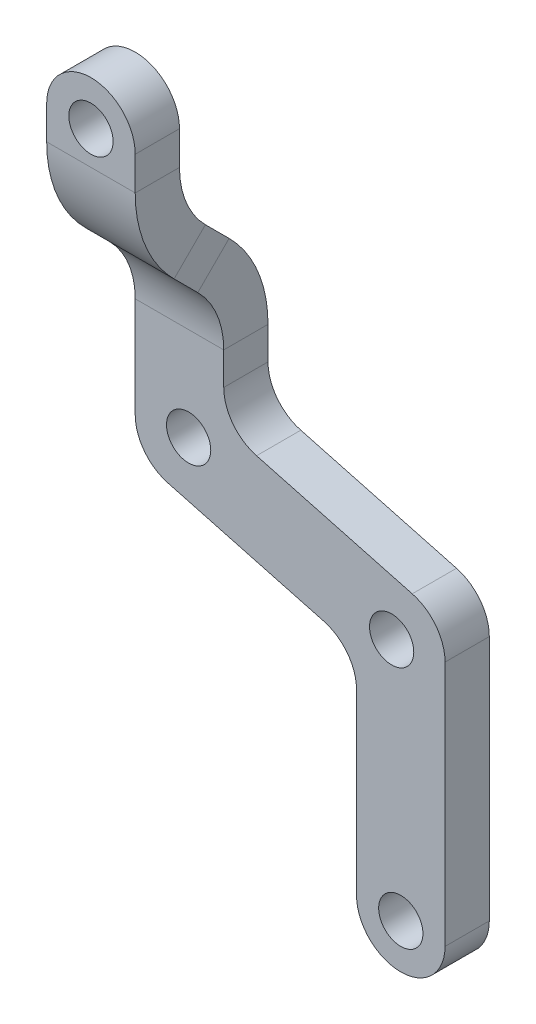
ISO-10303-21;
HEADER;
FILE_DESCRIPTION(('STEP AP214'),'2;1');
FILE_NAME('part.step','',(''),(''),'','','');
FILE_SCHEMA(('AUTOMOTIVE_DESIGN { 1 0 10303 214 1 1 1 1 }'));
ENDSEC;
DATA;
#1=APPLICATION_CONTEXT('core data for automotive mechanical design processes');
#2=APPLICATION_PROTOCOL_DEFINITION('international standard','automotive_design',2000,#1);
#3=PRODUCT_CONTEXT('',#1,'mechanical');
#4=PRODUCT('Part','Part','',(#3));
#5=PRODUCT_RELATED_PRODUCT_CATEGORY('part','',(#4));
#6=PRODUCT_DEFINITION_FORMATION('','',#4);
#7=PRODUCT_DEFINITION_CONTEXT('part definition',#1,'design');
#8=PRODUCT_DEFINITION('design','',#6,#7);
#9=PRODUCT_DEFINITION_SHAPE('','',#8);
#10=(LENGTH_UNIT() NAMED_UNIT(*) SI_UNIT(.MILLI.,.METRE.));
#11=(NAMED_UNIT(*) PLANE_ANGLE_UNIT() SI_UNIT($,.RADIAN.));
#12=(NAMED_UNIT(*) SI_UNIT($,.STERADIAN.) SOLID_ANGLE_UNIT());
#13=UNCERTAINTY_MEASURE_WITH_UNIT(LENGTH_MEASURE(1.E-05),#10,'distance_accuracy_value','');
#14=(GEOMETRIC_REPRESENTATION_CONTEXT(3) GLOBAL_UNCERTAINTY_ASSIGNED_CONTEXT((#13)) GLOBAL_UNIT_ASSIGNED_CONTEXT((#10,
#11,#12)) REPRESENTATION_CONTEXT('',''));
#15=CARTESIAN_POINT('',(0.,0.,0.));
#16=DIRECTION('',(0.,0.,1.));
#17=DIRECTION('',(1.,0.,0.));
#18=AXIS2_PLACEMENT_3D('',#15,#16,#17);
#19=CARTESIAN_POINT('',(0.,5.94666081272551,-8.05799540912749));
#20=DIRECTION('',(0.,-0.707106781186549,0.707106781186546));
#21=DIRECTION('',(1.,0.,0.));
#22=AXIS2_PLACEMENT_3D('',#19,#20,#21);
#23=PLANE('',#22);
#24=DIRECTION('',(0.,0.707106781186546,0.707106781186549));
#25=VECTOR('',#24,1.);
#26=CARTESIAN_POINT('',(-7.5,5.94666081272551,-8.05799540912749));
#27=LINE('',#26,#25);
#28=CARTESIAN_POINT('',(-7.5,21.0757240337185,7.07106781186551));
#29=VERTEX_POINT('',#28);
#30=CARTESIAN_POINT('',(-7.5,18.3980545040548,4.39339828220182));
#31=VERTEX_POINT('',#30);
#32=EDGE_CURVE('E246',#29,#31,#27,.F.);
#33=ORIENTED_EDGE('',*,*,#32,.T.);
#34=DIRECTION('',(-1.,0.,0.));
#35=VECTOR('',#34,1.);
#36=CARTESIAN_POINT('',(0.,18.3980545040548,4.39339828220182));
#37=LINE('',#36,#35);
#38=CARTESIAN_POINT('',(-17.5,18.3980545040548,4.39339828220182));
#39=VERTEX_POINT('',#38);
#40=EDGE_CURVE('E310',#31,#39,#37,.T.);
#41=ORIENTED_EDGE('',*,*,#40,.T.);
#42=DIRECTION('',(0.,0.707106781186546,0.707106781186549));
#43=VECTOR('',#42,1.);
#44=CARTESIAN_POINT('',(-17.5,5.94666081272551,-8.05799540912749));
#45=LINE('',#44,#43);
#46=CARTESIAN_POINT('',(-17.5,21.0757240337185,7.07106781186554));
#47=VERTEX_POINT('',#46);
#48=EDGE_CURVE('E329',#47,#39,#45,.F.);
#49=ORIENTED_EDGE('',*,*,#48,.F.);
#50=DIRECTION('',(-1.,0.,0.));
#51=VECTOR('',#50,1.);
#52=CARTESIAN_POINT('',(0.,21.0757240337185,7.07106781186554));
#53=LINE('',#52,#51);
#54=EDGE_CURVE('E322',#29,#47,#53,.T.);
#55=ORIENTED_EDGE('',*,*,#54,.F.);
#56=EDGE_LOOP('',(#33,#41,#49,#55));
#57=FACE_BOUND('',#56,.T.);
#58=ADVANCED_FACE('F44',(#57),#23,.F.);
#59=CARTESIAN_POINT('',(0.,2.41112690679276,-4.52246150319476));
#60=DIRECTION('',(0.,-0.707106781186549,0.707106781186546));
#61=DIRECTION('',(1.,0.,0.));
#62=AXIS2_PLACEMENT_3D('',#59,#60,#61);
#63=PLANE('',#62);
#64=DIRECTION('',(-1.,0.,0.));
#65=VECTOR('',#64,1.);
#66=CARTESIAN_POINT('',(0.,14.862520598122,7.92893218813452));
#67=LINE('',#66,#65);
#68=CARTESIAN_POINT('',(-7.5,14.862520598122,7.92893218813454));
#69=VERTEX_POINT('',#68);
#70=CARTESIAN_POINT('',(-17.5,14.862520598122,7.92893218813455));
#71=VERTEX_POINT('',#70);
#72=EDGE_CURVE('E303',#69,#71,#67,.T.);
#73=ORIENTED_EDGE('',*,*,#72,.F.);
#74=DIRECTION('',(0.,-0.707106781186546,-0.707106781186549));
#75=VECTOR('',#74,1.);
#76=CARTESIAN_POINT('',(-7.5,2.41112690679276,-4.52246150319476));
#77=LINE('',#76,#75);
#78=CARTESIAN_POINT('',(-7.5,17.5401901277857,10.6066017177982));
#79=VERTEX_POINT('',#78);
#80=EDGE_CURVE('E331',#79,#69,#77,.T.);
#81=ORIENTED_EDGE('',*,*,#80,.F.);
#82=DIRECTION('',(-1.,0.,0.));
#83=VECTOR('',#82,1.);
#84=CARTESIAN_POINT('',(0.,17.5401901277857,10.6066017177982));
#85=LINE('',#84,#83);
#86=CARTESIAN_POINT('',(-17.5,17.5401901277857,10.6066017177982));
#87=VERTEX_POINT('',#86);
#88=EDGE_CURVE('E316',#79,#87,#85,.T.);
#89=ORIENTED_EDGE('',*,*,#88,.T.);
#90=DIRECTION('',(0.,-0.707106781186546,-0.707106781186549));
#91=VECTOR('',#90,1.);
#92=CARTESIAN_POINT('',(-17.5,2.41112690679276,-4.52246150319476));
#93=LINE('',#92,#91);
#94=EDGE_CURVE('E307',#87,#71,#93,.T.);
#95=ORIENTED_EDGE('',*,*,#94,.T.);
#96=EDGE_LOOP('',(#73,#81,#89,#95));
#97=FACE_BOUND('',#96,.T.);
#98=ADVANCED_FACE('F432',(#97),#63,.T.);
#99=CARTESIAN_POINT('',(-7.5,2.41112690679276,-4.52246150319476));
#100=DIRECTION('',(-1.,0.,0.));
#101=DIRECTION('',(0.,-0.707106781186546,-0.707106781186549));
#102=AXIS2_PLACEMENT_3D('',#99,#100,#101);
#103=PLANE('',#102);
#104=DIRECTION('',(0.,-0.707106781186554,0.707106781186541));
#105=VECTOR('',#104,1.);
#106=CARTESIAN_POINT('',(-7.5,14.8625205981219,7.92893218813461));
#107=LINE('',#106,#105);
#108=EDGE_CURVE('E313',#31,#69,#107,.T.);
#109=ORIENTED_EDGE('',*,*,#108,.F.);
#110=ORIENTED_EDGE('',*,*,#32,.F.);
#111=DIRECTION('',(0.,-0.707106781186554,0.707106781186541));
#112=VECTOR('',#111,1.);
#113=CARTESIAN_POINT('',(-7.5,17.5401901277856,10.6066017177984));
#114=LINE('',#113,#112);
#115=EDGE_CURVE('E319',#29,#79,#114,.T.);
#116=ORIENTED_EDGE('',*,*,#115,.T.);
#117=ORIENTED_EDGE('',*,*,#80,.T.);
#118=EDGE_LOOP('',(#109,#110,#116,#117));
#119=FACE_BOUND('',#118,.T.);
#120=ADVANCED_FACE('F469',(#119),#103,.F.);
#121=CARTESIAN_POINT('',(-17.5,2.41112690679276,-4.52246150319476));
#122=DIRECTION('',(-1.,0.,0.));
#123=DIRECTION('',(0.,-0.707106781186546,-0.707106781186549));
#124=AXIS2_PLACEMENT_3D('',#121,#122,#123);
#125=PLANE('',#124);
#126=DIRECTION('',(0.,0.707106781186554,-0.707106781186541));
#127=VECTOR('',#126,1.);
#128=CARTESIAN_POINT('',(-17.5,14.8625205981219,7.92893218813461));
#129=LINE('',#128,#127);
#130=EDGE_CURVE('E306',#71,#39,#129,.T.);
#131=ORIENTED_EDGE('',*,*,#130,.F.);
#132=ORIENTED_EDGE('',*,*,#94,.F.);
#133=DIRECTION('',(0.,0.707106781186554,-0.707106781186541));
#134=VECTOR('',#133,1.);
#135=CARTESIAN_POINT('',(-17.5,17.5401901277856,10.6066017177984));
#136=LINE('',#135,#134);
#137=EDGE_CURVE('E325',#87,#47,#136,.T.);
#138=ORIENTED_EDGE('',*,*,#137,.T.);
#139=ORIENTED_EDGE('',*,*,#48,.T.);
#140=EDGE_LOOP('',(#131,#132,#138,#139));
#141=FACE_BOUND('',#140,.T.);
#142=ADVANCED_FACE('F429',(#141),#125,.T.);
#143=CARTESIAN_POINT('',(0.334936490538905,-1.81641159001248,5.));
#144=DIRECTION('',(-0.258819045102521,-0.965925826289068,0.));
#145=DIRECTION('',(0.965925826289068,-0.258819045102521,0.));
#146=AXIS2_PLACEMENT_3D('',#143,#144,#145);
#147=PLANE('',#146);
#148=DIRECTION('',(0.965925826289068,-0.258819045102521,0.));
#149=VECTOR('',#148,1.);
#150=CARTESIAN_POINT('',(0.334936490538905,-1.81641159001248,5.));
#151=LINE('',#150,#149);
#152=CARTESIAN_POINT('',(-3.79409522551261,-0.710040876173984,5.));
#153=VERTEX_POINT('',#152);
#154=CARTESIAN_POINT('',(13.7940952255126,-5.42278230385099,5.));
#155=VERTEX_POINT('',#154);
#156=EDGE_CURVE('E298',#153,#155,#151,.T.);
#157=ORIENTED_EDGE('',*,*,#156,.T.);
#158=DIRECTION('',(0.,0.,-1.));
#159=VECTOR('',#158,1.);
#160=CARTESIAN_POINT('',(13.7940952255126,-5.42278230385099,5.));
#161=LINE('',#160,#159);
#162=CARTESIAN_POINT('',(13.7940952255126,-5.42278230385099,0.));
#163=VERTEX_POINT('',#162);
#164=EDGE_CURVE('E346',#155,#163,#161,.T.);
#165=ORIENTED_EDGE('',*,*,#164,.T.);
#166=DIRECTION('',(0.965925826289068,-0.258819045102521,0.));
#167=VECTOR('',#166,1.);
#168=CARTESIAN_POINT('',(0.334936490538905,-1.81641159001248,0.));
#169=LINE('',#168,#167);
#170=CARTESIAN_POINT('',(-3.79409522551261,-0.710040876173984,0.));
#171=VERTEX_POINT('',#170);
#172=EDGE_CURVE('E255',#171,#163,#169,.T.);
#173=ORIENTED_EDGE('',*,*,#172,.F.);
#174=DIRECTION('',(0.,0.,-1.));
#175=VECTOR('',#174,1.);
#176=CARTESIAN_POINT('',(-3.79409522551261,-0.710040876173984,5.));
#177=LINE('',#176,#175);
#178=EDGE_CURVE('E343',#171,#153,#177,.F.);
#179=ORIENTED_EDGE('',*,*,#178,.T.);
#180=EDGE_LOOP('',(#157,#165,#173,#179));
#181=FACE_BOUND('',#180,.T.);
#182=ADVANCED_FACE('F384',(#181),#147,.F.);
#183=CARTESIAN_POINT('',(17.5,-3.06641159001248,5.));
#184=DIRECTION('',(-1.,0.,0.));
#185=DIRECTION('',(0.,-1.,0.));
#186=AXIS2_PLACEMENT_3D('',#183,#184,#185);
#187=PLANE('',#186);
#188=DIRECTION('',(0.,1.,0.));
#189=VECTOR('',#188,1.);
#190=CARTESIAN_POINT('',(17.5,-3.06641159001248,0.));
#191=LINE('',#190,#189);
#192=CARTESIAN_POINT('',(17.5,-10.2524114352963,0.));
#193=VERTEX_POINT('',#192);
#194=CARTESIAN_POINT('',(17.5,-38.0664115900125,0.));
#195=VERTEX_POINT('',#194);
#196=EDGE_CURVE('E253',#193,#195,#191,.F.);
#197=ORIENTED_EDGE('',*,*,#196,.F.);
#198=DIRECTION('',(0.,0.,-1.));
#199=VECTOR('',#198,1.);
#200=CARTESIAN_POINT('',(17.5,-10.2524114352963,5.));
#201=LINE('',#200,#199);
#202=CARTESIAN_POINT('',(17.5,-10.2524114352963,5.));
#203=VERTEX_POINT('',#202);
#204=EDGE_CURVE('E328',#193,#203,#201,.F.);
#205=ORIENTED_EDGE('',*,*,#204,.T.);
#206=DIRECTION('',(0.,-1.,0.));
#207=VECTOR('',#206,1.);
#208=CARTESIAN_POINT('',(17.5,-3.06641159001248,5.));
#209=LINE('',#208,#207);
#210=CARTESIAN_POINT('',(17.5,-38.0664115900125,5.));
#211=VERTEX_POINT('',#210);
#212=EDGE_CURVE('E296',#203,#211,#209,.T.);
#213=ORIENTED_EDGE('',*,*,#212,.T.);
#214=DIRECTION('',(0.,0.,1.));
#215=VECTOR('',#214,1.);
#216=CARTESIAN_POINT('',(17.5,-38.0664115900125,5.));
#217=LINE('',#216,#215);
#218=EDGE_CURVE('E290',#195,#211,#217,.T.);
#219=ORIENTED_EDGE('',*,*,#218,.F.);
#220=EDGE_LOOP('',(#197,#205,#213,#219));
#221=FACE_BOUND('',#220,.T.);
#222=ADVANCED_FACE('F393',(#221),#187,.F.);
#223=CARTESIAN_POINT('',(12.5,-38.0664115900125,5.));
#224=DIRECTION('',(0.,0.,1.));
#225=DIRECTION('',(1.,0.,0.));
#226=AXIS2_PLACEMENT_3D('',#223,#224,#225);
#227=CYLINDRICAL_SURFACE('',#226,4.99999999999999);
#228=DIRECTION('',(0.,0.,1.));
#229=VECTOR('',#228,1.);
#230=CARTESIAN_POINT('',(7.50000000000001,-38.0664115900125,5.));
#231=LINE('',#230,#229);
#232=CARTESIAN_POINT('',(7.50000000000001,-38.0664115900125,0.));
#233=VERTEX_POINT('',#232);
#234=CARTESIAN_POINT('',(7.50000000000001,-38.0664115900125,5.));
#235=VERTEX_POINT('',#234);
#236=EDGE_CURVE('E285',#233,#235,#231,.T.);
#237=ORIENTED_EDGE('',*,*,#236,.F.);
#238=CARTESIAN_POINT('',(12.5,-38.0664115900125,0.));
#239=DIRECTION('',(0.,0.,1.));
#240=DIRECTION('',(1.,0.,0.));
#241=AXIS2_PLACEMENT_3D('',#238,#239,#240);
#242=CIRCLE('',#241,4.99999999999999);
#243=EDGE_CURVE('E293',#233,#195,#242,.T.);
#244=ORIENTED_EDGE('',*,*,#243,.T.);
#245=ORIENTED_EDGE('',*,*,#218,.T.);
#246=CARTESIAN_POINT('',(12.5,-38.0664115900125,5.));
#247=DIRECTION('',(0.,0.,1.));
#248=DIRECTION('',(1.,0.,0.));
#249=AXIS2_PLACEMENT_3D('',#246,#247,#248);
#250=CIRCLE('',#249,4.99999999999999);
#251=EDGE_CURVE('E266',#235,#211,#250,.T.);
#252=ORIENTED_EDGE('',*,*,#251,.F.);
#253=EDGE_LOOP('',(#237,#244,#245,#252));
#254=FACE_BOUND('',#253,.T.);
#255=ADVANCED_FACE('F397',(#254),#227,.T.);
#256=CARTESIAN_POINT('',(7.5,-3.06641159001248,5.));
#257=DIRECTION('',(-1.,0.,0.));
#258=DIRECTION('',(0.,-1.,0.));
#259=AXIS2_PLACEMENT_3D('',#256,#257,#258);
#260=PLANE('',#259);
#261=DIRECTION('',(0.,-1.,0.));
#262=VECTOR('',#261,1.);
#263=CARTESIAN_POINT('',(7.5,-3.06641159001248,5.));
#264=LINE('',#263,#262);
#265=CARTESIAN_POINT('',(7.5,-17.9256813150859,5.));
#266=VERTEX_POINT('',#265);
#267=EDGE_CURVE('E269',#266,#235,#264,.T.);
#268=ORIENTED_EDGE('',*,*,#267,.F.);
#269=DIRECTION('',(0.,0.,1.));
#270=VECTOR('',#269,1.);
#271=CARTESIAN_POINT('',(7.5,-17.9256813150859,0.));
#272=LINE('',#271,#270);
#273=CARTESIAN_POINT('',(7.5,-17.9256813150859,0.));
#274=VERTEX_POINT('',#273);
#275=EDGE_CURVE('E356',#266,#274,#272,.F.);
#276=ORIENTED_EDGE('',*,*,#275,.T.);
#277=DIRECTION('',(0.,1.,0.));
#278=VECTOR('',#277,1.);
#279=CARTESIAN_POINT('',(7.5,-3.06641159001248,0.));
#280=LINE('',#279,#278);
#281=EDGE_CURVE('E288',#274,#233,#280,.F.);
#282=ORIENTED_EDGE('',*,*,#281,.T.);
#283=ORIENTED_EDGE('',*,*,#236,.T.);
#284=EDGE_LOOP('',(#268,#276,#282,#283));
#285=FACE_BOUND('',#284,.T.);
#286=ADVANCED_FACE('F562',(#285),#260,.T.);
#287=CARTESIAN_POINT('',(-2.25325396048631,-11.4756698529032,5.));
#288=DIRECTION('',(-0.258819045102521,-0.965925826289068,0.));
#289=DIRECTION('',(0.965925826289068,-0.258819045102521,0.));
#290=AXIS2_PLACEMENT_3D('',#287,#288,#289);
#291=PLANE('',#290);
#292=DIRECTION('',(0.965925826289068,-0.258819045102521,0.));
#293=VECTOR('',#292,1.);
#294=CARTESIAN_POINT('',(-2.25325396048631,-11.4756698529032,0.));
#295=LINE('',#294,#293);
#296=CARTESIAN_POINT('',(-13.7940952255126,-8.38331075596358,0.));
#297=VERTEX_POINT('',#296);
#298=CARTESIAN_POINT('',(3.79409522551261,-13.0960521836406,0.));
#299=VERTEX_POINT('',#298);
#300=EDGE_CURVE('E283',#297,#299,#295,.T.);
#301=ORIENTED_EDGE('',*,*,#300,.T.);
#302=DIRECTION('',(0.,0.,1.));
#303=VECTOR('',#302,1.);
#304=CARTESIAN_POINT('',(3.7940952255126,-13.0960521836406,5.));
#305=LINE('',#304,#303);
#306=CARTESIAN_POINT('',(3.79409522551261,-13.0960521836406,5.));
#307=VERTEX_POINT('',#306);
#308=EDGE_CURVE('E353',#299,#307,#305,.T.);
#309=ORIENTED_EDGE('',*,*,#308,.T.);
#310=DIRECTION('',(0.965925826289068,-0.258819045102521,0.));
#311=VECTOR('',#310,1.);
#312=CARTESIAN_POINT('',(-2.25325396048631,-11.4756698529032,5.));
#313=LINE('',#312,#311);
#314=CARTESIAN_POINT('',(-13.7940952255126,-8.38331075596358,5.));
#315=VERTEX_POINT('',#314);
#316=EDGE_CURVE('E271',#315,#307,#313,.T.);
#317=ORIENTED_EDGE('',*,*,#316,.F.);
#318=DIRECTION('',(0.,0.,1.));
#319=VECTOR('',#318,1.);
#320=CARTESIAN_POINT('',(-13.7940952255126,-8.38331075596358,5.));
#321=LINE('',#320,#319);
#322=EDGE_CURVE('E351',#315,#297,#321,.F.);
#323=ORIENTED_EDGE('',*,*,#322,.T.);
#324=EDGE_LOOP('',(#301,#309,#317,#323));
#325=FACE_BOUND('',#324,.T.);
#326=ADVANCED_FACE('F405',(#325),#291,.T.);
#327=CARTESIAN_POINT('',(12.5,-38.0664115900125,5.));
#328=DIRECTION('',(0.,0.,1.));
#329=DIRECTION('',(1.,0.,0.));
#330=AXIS2_PLACEMENT_3D('',#327,#328,#329);
#331=CYLINDRICAL_SURFACE('',#330,2.5);
#332=CARTESIAN_POINT('',(12.5,-38.0664115900125,5.));
#333=DIRECTION('',(0.,0.,1.));
#334=DIRECTION('',(1.,0.,0.));
#335=AXIS2_PLACEMENT_3D('',#332,#333,#334);
#336=CIRCLE('',#335,2.5);
#337=CARTESIAN_POINT('',(15.,-38.0664115900125,5.));
#338=VERTEX_POINT('',#337);
#339=EDGE_CURVE('E280',#338,#338,#336,.T.);
#340=ORIENTED_EDGE('',*,*,#339,.T.);
#341=EDGE_LOOP('',(#340));
#342=FACE_BOUND('',#341,.T.);
#343=CARTESIAN_POINT('',(12.5,-38.0664115900125,0.));
#344=DIRECTION('',(0.,0.,1.));
#345=DIRECTION('',(1.,0.,0.));
#346=AXIS2_PLACEMENT_3D('',#343,#344,#345);
#347=CIRCLE('',#346,2.5);
#348=CARTESIAN_POINT('',(15.,-38.0664115900125,0.));
#349=VERTEX_POINT('',#348);
#350=EDGE_CURVE('E250',#349,#349,#347,.T.);
#351=ORIENTED_EDGE('',*,*,#350,.F.);
#352=EDGE_LOOP('',(#351));
#353=FACE_BOUND('',#352,.T.);
#354=ADVANCED_FACE('F550',(#342,#353),#331,.F.);
#355=CARTESIAN_POINT('',(0.,0.,5.));
#356=DIRECTION('',(0.,0.,1.));
#357=DIRECTION('',(1.,0.,0.));
#358=AXIS2_PLACEMENT_3D('',#355,#356,#357);
#359=PLANE('',#358);
#360=CARTESIAN_POINT('',(11.4667667014562,-11.0452392301475,5.));
#361=DIRECTION('',(0.,0.,1.));
#362=DIRECTION('',(1.,0.,0.));
#363=AXIS2_PLACEMENT_3D('',#360,#361,#362);
#364=CIRCLE('',#363,2.5);
#365=CARTESIAN_POINT('',(13.9667667014562,-11.0452392301475,5.));
#366=VERTEX_POINT('',#365);
#367=EDGE_CURVE('E858',#366,#366,#364,.T.);
#368=ORIENTED_EDGE('',*,*,#367,.F.);
#369=EDGE_LOOP('',(#368));
#370=FACE_BOUND('',#369,.T.);
#371=CARTESIAN_POINT('',(-11.4667667014562,-2.76085382966705,5.));
#372=DIRECTION('',(0.,0.,1.));
#373=DIRECTION('',(1.,0.,0.));
#374=AXIS2_PLACEMENT_3D('',#371,#372,#373);
#375=CIRCLE('',#374,2.5);
#376=CARTESIAN_POINT('',(-8.96676670145617,-2.76085382966705,5.));
#377=VERTEX_POINT('',#376);
#378=EDGE_CURVE('E856',#377,#377,#375,.T.);
#379=ORIENTED_EDGE('',*,*,#378,.F.);
#380=EDGE_LOOP('',(#379));
#381=FACE_BOUND('',#380,.T.);
#382=ORIENTED_EDGE('',*,*,#339,.F.);
#383=EDGE_LOOP('',(#382));
#384=FACE_BOUND('',#383,.T.);
#385=ORIENTED_EDGE('',*,*,#212,.F.);
#386=CARTESIAN_POINT('',(12.5,-10.2524114352963,5.));
#387=DIRECTION('',(0.,0.,1.));
#388=DIRECTION('',(1.,0.,0.));
#389=AXIS2_PLACEMENT_3D('',#386,#387,#388);
#390=CIRCLE('',#389,5.);
#391=EDGE_CURVE('E341',#203,#155,#390,.T.);
#392=ORIENTED_EDGE('',*,*,#391,.T.);
#393=ORIENTED_EDGE('',*,*,#156,.F.);
#394=CARTESIAN_POINT('',(-2.5,4.11958825527136,5.));
#395=DIRECTION('',(0.,0.,1.));
#396=DIRECTION('',(1.,0.,0.));
#397=AXIS2_PLACEMENT_3D('',#394,#395,#396);
#398=CIRCLE('',#397,5.);
#399=CARTESIAN_POINT('',(-7.5,4.11958825527136,5.));
#400=VERTEX_POINT('',#399);
#401=EDGE_CURVE('E52',#153,#400,#398,.F.);
#402=ORIENTED_EDGE('',*,*,#401,.T.);
#403=DIRECTION('',(0.,-1.,0.));
#404=VECTOR('',#403,1.);
#405=CARTESIAN_POINT('',(-7.5,0.,5.));
#406=LINE('',#405,#404);
#407=CARTESIAN_POINT('',(-7.5,7.79145278625651,5.));
#408=VERTEX_POINT('',#407);
#409=EDGE_CURVE('E243',#408,#400,#406,.T.);
#410=ORIENTED_EDGE('',*,*,#409,.F.);
#411=DIRECTION('',(-1.,0.,0.));
#412=VECTOR('',#411,1.);
#413=CARTESIAN_POINT('',(0.,7.79145278625651,5.));
#414=LINE('',#413,#412);
#415=CARTESIAN_POINT('',(-17.5,7.79145278625651,5.));
#416=VERTEX_POINT('',#415);
#417=EDGE_CURVE('E277',#408,#416,#414,.T.);
#418=ORIENTED_EDGE('',*,*,#417,.T.);
#419=DIRECTION('',(0.,-1.,0.));
#420=VECTOR('',#419,1.);
#421=CARTESIAN_POINT('',(-17.5,0.,5.));
#422=LINE('',#421,#420);
#423=CARTESIAN_POINT('',(-17.5,-3.55368162451824,5.));
#424=VERTEX_POINT('',#423);
#425=EDGE_CURVE('E274',#416,#424,#422,.T.);
#426=ORIENTED_EDGE('',*,*,#425,.T.);
#427=CARTESIAN_POINT('',(-12.5,-3.55368162451824,5.));
#428=DIRECTION('',(0.,0.,1.));
#429=DIRECTION('',(1.,0.,0.));
#430=AXIS2_PLACEMENT_3D('',#427,#428,#429);
#431=CIRCLE('',#430,5.);
#432=EDGE_CURVE('E339',#424,#315,#431,.T.);
#433=ORIENTED_EDGE('',*,*,#432,.T.);
#434=ORIENTED_EDGE('',*,*,#316,.T.);
#435=CARTESIAN_POINT('',(2.5,-17.9256813150859,5.));
#436=DIRECTION('',(0.,0.,1.));
#437=DIRECTION('',(1.,0.,0.));
#438=AXIS2_PLACEMENT_3D('',#435,#436,#437);
#439=CIRCLE('',#438,5.);
#440=EDGE_CURVE('E363',#307,#266,#439,.F.);
#441=ORIENTED_EDGE('',*,*,#440,.T.);
#442=ORIENTED_EDGE('',*,*,#267,.T.);
#443=ORIENTED_EDGE('',*,*,#251,.T.);
#444=EDGE_LOOP('',(#385,#392,#393,#402,#410,#418,#426,#433,#434,#441,#442,#443));
#445=FACE_BOUND('',#444,.T.);
#446=ADVANCED_FACE('F369',(#370,#381,#384,#445),#359,.T.);
#447=CARTESIAN_POINT('',(-17.5,0.,5.));
#448=DIRECTION('',(-1.,0.,0.));
#449=DIRECTION('',(0.,-1.,0.));
#450=AXIS2_PLACEMENT_3D('',#447,#448,#449);
#451=PLANE('',#450);
#452=DIRECTION('',(0.,1.,0.));
#453=VECTOR('',#452,1.);
#454=CARTESIAN_POINT('',(-17.5,0.,0.));
#455=LINE('',#454,#453);
#456=CARTESIAN_POINT('',(-17.5,7.79145278625655,0.));
#457=VERTEX_POINT('',#456);
#458=CARTESIAN_POINT('',(-17.5,-3.55368162451824,0.));
#459=VERTEX_POINT('',#458);
#460=EDGE_CURVE('E261',#457,#459,#455,.F.);
#461=ORIENTED_EDGE('',*,*,#460,.T.);
#462=DIRECTION('',(0.,0.,1.));
#463=VECTOR('',#462,1.);
#464=CARTESIAN_POINT('',(-17.5,-3.55368162451824,5.));
#465=LINE('',#464,#463);
#466=EDGE_CURVE('E360',#459,#424,#465,.T.);
#467=ORIENTED_EDGE('',*,*,#466,.T.);
#468=ORIENTED_EDGE('',*,*,#425,.F.);
#469=DIRECTION('',(0.,0.,-1.));
#470=VECTOR('',#469,1.);
#471=CARTESIAN_POINT('',(-17.5,7.79145278625651,5.00000000000006));
#472=LINE('',#471,#470);
#473=EDGE_CURVE('E263',#416,#457,#472,.T.);
#474=ORIENTED_EDGE('',*,*,#473,.T.);
#475=EDGE_LOOP('',(#461,#467,#468,#474));
#476=FACE_BOUND('',#475,.T.);
#477=ADVANCED_FACE('F412',(#476),#451,.T.);
#478=CARTESIAN_POINT('',(0.,0.,0.));
#479=DIRECTION('',(0.,0.,1.));
#480=DIRECTION('',(1.,0.,0.));
#481=AXIS2_PLACEMENT_3D('',#478,#479,#480);
#482=PLANE('',#481);
#483=CARTESIAN_POINT('',(11.4667667014562,-11.0452392301475,0.));
#484=DIRECTION('',(0.,0.,1.));
#485=DIRECTION('',(1.,0.,0.));
#486=AXIS2_PLACEMENT_3D('',#483,#484,#485);
#487=CIRCLE('',#486,2.5);
#488=CARTESIAN_POINT('',(13.9667667014562,-11.0452392301475,0.));
#489=VERTEX_POINT('',#488);
#490=EDGE_CURVE('E220',#489,#489,#487,.T.);
#491=ORIENTED_EDGE('',*,*,#490,.T.);
#492=EDGE_LOOP('',(#491));
#493=FACE_BOUND('',#492,.T.);
#494=CARTESIAN_POINT('',(-11.4667667014562,-2.76085382966705,0.));
#495=DIRECTION('',(0.,0.,1.));
#496=DIRECTION('',(1.,0.,0.));
#497=AXIS2_PLACEMENT_3D('',#494,#495,#496);
#498=CIRCLE('',#497,2.5);
#499=CARTESIAN_POINT('',(-8.96676670145617,-2.76085382966705,0.));
#500=VERTEX_POINT('',#499);
#501=EDGE_CURVE('E853',#500,#500,#498,.T.);
#502=ORIENTED_EDGE('',*,*,#501,.T.);
#503=EDGE_LOOP('',(#502));
#504=FACE_BOUND('',#503,.T.);
#505=ORIENTED_EDGE('',*,*,#172,.T.);
#506=CARTESIAN_POINT('',(12.5,-10.2524114352963,0.));
#507=DIRECTION('',(0.,0.,1.));
#508=DIRECTION('',(1.,0.,0.));
#509=AXIS2_PLACEMENT_3D('',#506,#507,#508);
#510=CIRCLE('',#509,5.);
#511=EDGE_CURVE('E349',#163,#193,#510,.F.);
#512=ORIENTED_EDGE('',*,*,#511,.T.);
#513=ORIENTED_EDGE('',*,*,#196,.T.);
#514=ORIENTED_EDGE('',*,*,#243,.F.);
#515=ORIENTED_EDGE('',*,*,#281,.F.);
#516=CARTESIAN_POINT('',(2.5,-17.9256813150859,0.));
#517=DIRECTION('',(0.,0.,1.));
#518=DIRECTION('',(1.,0.,0.));
#519=AXIS2_PLACEMENT_3D('',#516,#517,#518);
#520=CIRCLE('',#519,5.);
#521=EDGE_CURVE('E65',#274,#299,#520,.T.);
#522=ORIENTED_EDGE('',*,*,#521,.T.);
#523=ORIENTED_EDGE('',*,*,#300,.F.);
#524=CARTESIAN_POINT('',(-12.5,-3.55368162451824,0.));
#525=DIRECTION('',(0.,0.,1.));
#526=DIRECTION('',(1.,0.,0.));
#527=AXIS2_PLACEMENT_3D('',#524,#525,#526);
#528=CIRCLE('',#527,5.);
#529=EDGE_CURVE('E59',#297,#459,#528,.F.);
#530=ORIENTED_EDGE('',*,*,#529,.T.);
#531=ORIENTED_EDGE('',*,*,#460,.F.);
#532=DIRECTION('',(-1.,0.,0.));
#533=VECTOR('',#532,1.);
#534=CARTESIAN_POINT('',(0.,7.79145278625655,0.));
#535=LINE('',#534,#533);
#536=CARTESIAN_POINT('',(-7.5,7.79145278625652,0.));
#537=VERTEX_POINT('',#536);
#538=EDGE_CURVE('E239',#537,#457,#535,.T.);
#539=ORIENTED_EDGE('',*,*,#538,.F.);
#540=DIRECTION('',(0.,1.,0.));
#541=VECTOR('',#540,1.);
#542=CARTESIAN_POINT('',(-7.5,0.,0.));
#543=LINE('',#542,#541);
#544=CARTESIAN_POINT('',(-7.5,4.11958825527136,0.));
#545=VERTEX_POINT('',#544);
#546=EDGE_CURVE('E258',#537,#545,#543,.F.);
#547=ORIENTED_EDGE('',*,*,#546,.T.);
#548=CARTESIAN_POINT('',(-2.5,4.11958825527136,0.));
#549=DIRECTION('',(0.,0.,1.));
#550=DIRECTION('',(1.,0.,0.));
#551=AXIS2_PLACEMENT_3D('',#548,#549,#550);
#552=CIRCLE('',#551,5.);
#553=EDGE_CURVE('E12',#545,#171,#552,.T.);
#554=ORIENTED_EDGE('',*,*,#553,.T.);
#555=EDGE_LOOP('',(#505,#512,#513,#514,#515,#522,#523,#530,#531,#539,#547,#554));
#556=FACE_BOUND('',#555,.T.);
#557=ORIENTED_EDGE('',*,*,#350,.T.);
#558=EDGE_LOOP('',(#557));
#559=FACE_BOUND('',#558,.T.);
#560=ADVANCED_FACE('F379',(#493,#504,#556,#559),#482,.F.);
#561=CARTESIAN_POINT('',(-7.5,0.,5.));
#562=DIRECTION('',(-1.,0.,0.));
#563=DIRECTION('',(0.,-1.,0.));
#564=AXIS2_PLACEMENT_3D('',#561,#562,#563);
#565=PLANE('',#564);
#566=ORIENTED_EDGE('',*,*,#409,.T.);
#567=DIRECTION('',(0.,0.,-1.));
#568=VECTOR('',#567,1.);
#569=CARTESIAN_POINT('',(-7.5,4.11958825527136,0.));
#570=LINE('',#569,#568);
#571=EDGE_CURVE('E358',#400,#545,#570,.T.);
#572=ORIENTED_EDGE('',*,*,#571,.T.);
#573=ORIENTED_EDGE('',*,*,#546,.F.);
#574=DIRECTION('',(0.,0.,1.));
#575=VECTOR('',#574,1.);
#576=CARTESIAN_POINT('',(-7.5,7.79145278625651,5.00000000000006));
#577=LINE('',#576,#575);
#578=EDGE_CURVE('E247',#537,#408,#577,.T.);
#579=ORIENTED_EDGE('',*,*,#578,.T.);
#580=EDGE_LOOP('',(#566,#572,#573,#579));
#581=FACE_BOUND('',#580,.T.);
#582=ADVANCED_FACE('F374',(#581),#565,.F.);
#583=CARTESIAN_POINT('',(-7.5,7.79145278625651,15.));
#584=DIRECTION('',(-1.,0.,0.));
#585=DIRECTION('',(0.,0.,1.));
#586=AXIS2_PLACEMENT_3D('',#583,#584,#585);
#587=PLANE('',#586);
#588=ORIENTED_EDGE('',*,*,#578,.F.);
#589=CARTESIAN_POINT('',(-7.5,7.79145278625651,15.));
#590=DIRECTION('',(-1.,0.,0.));
#591=DIRECTION('',(0.,0.,1.));
#592=AXIS2_PLACEMENT_3D('',#589,#590,#591);
#593=CIRCLE('',#592,15.);
#594=EDGE_CURVE('E228',#537,#31,#593,.F.);
#595=ORIENTED_EDGE('',*,*,#594,.T.);
#596=ORIENTED_EDGE('',*,*,#108,.T.);
#597=CARTESIAN_POINT('',(-7.5,7.79145278625651,15.));
#598=DIRECTION('',(1.,0.,0.));
#599=DIRECTION('',(0.,0.,1.));
#600=AXIS2_PLACEMENT_3D('',#597,#598,#599);
#601=CIRCLE('',#600,10.);
#602=EDGE_CURVE('E232',#408,#69,#601,.T.);
#603=ORIENTED_EDGE('',*,*,#602,.F.);
#604=EDGE_LOOP('',(#588,#595,#596,#603));
#605=FACE_BOUND('',#604,.T.);
#606=ADVANCED_FACE('F419',(#605),#587,.F.);
#607=CARTESIAN_POINT('',(-17.5,7.79145278625651,15.));
#608=DIRECTION('',(1.,0.,0.));
#609=DIRECTION('',(0.,0.,-1.));
#610=AXIS2_PLACEMENT_3D('',#607,#608,#609);
#611=PLANE('',#610);
#612=CARTESIAN_POINT('',(-17.5,7.79145278625651,15.));
#613=DIRECTION('',(-1.,0.,0.));
#614=DIRECTION('',(0.,0.,1.));
#615=AXIS2_PLACEMENT_3D('',#612,#613,#614);
#616=CIRCLE('',#615,15.);
#617=EDGE_CURVE('E236',#39,#457,#616,.T.);
#618=ORIENTED_EDGE('',*,*,#617,.T.);
#619=ORIENTED_EDGE('',*,*,#473,.F.);
#620=CARTESIAN_POINT('',(-17.5,7.79145278625651,15.));
#621=DIRECTION('',(-1.,0.,0.));
#622=DIRECTION('',(0.,0.,1.));
#623=AXIS2_PLACEMENT_3D('',#620,#621,#622);
#624=CIRCLE('',#623,10.);
#625=EDGE_CURVE('E235',#71,#416,#624,.T.);
#626=ORIENTED_EDGE('',*,*,#625,.F.);
#627=ORIENTED_EDGE('',*,*,#130,.T.);
#628=EDGE_LOOP('',(#618,#619,#626,#627));
#629=FACE_BOUND('',#628,.T.);
#630=ADVANCED_FACE('F426',(#629),#611,.F.);
#631=CARTESIAN_POINT('',(2.37893999851433,7.79145278625651,15.));
#632=DIRECTION('',(-1.,0.,0.));
#633=DIRECTION('',(0.,0.,1.));
#634=AXIS2_PLACEMENT_3D('',#631,#632,#633);
#635=CYLINDRICAL_SURFACE('',#634,10.);
#636=ORIENTED_EDGE('',*,*,#72,.T.);
#637=ORIENTED_EDGE('',*,*,#625,.T.);
#638=ORIENTED_EDGE('',*,*,#417,.F.);
#639=ORIENTED_EDGE('',*,*,#602,.T.);
#640=EDGE_LOOP('',(#636,#637,#638,#639));
#641=FACE_BOUND('',#640,.T.);
#642=ADVANCED_FACE('F423',(#641),#635,.F.);
#643=CARTESIAN_POINT('',(2.37893999851433,7.79145278625651,15.));
#644=DIRECTION('',(-1.,0.,0.));
#645=DIRECTION('',(0.,0.,1.));
#646=AXIS2_PLACEMENT_3D('',#643,#644,#645);
#647=CYLINDRICAL_SURFACE('',#646,15.);
#648=ORIENTED_EDGE('',*,*,#40,.F.);
#649=ORIENTED_EDGE('',*,*,#594,.F.);
#650=ORIENTED_EDGE('',*,*,#538,.T.);
#651=ORIENTED_EDGE('',*,*,#617,.F.);
#652=EDGE_LOOP('',(#648,#649,#650,#651));
#653=FACE_BOUND('',#652,.T.);
#654=ADVANCED_FACE('F417',(#653),#647,.T.);
#655=CARTESIAN_POINT('',(-7.5,28.146791845584,0.));
#656=DIRECTION('',(1.,0.,0.));
#657=DIRECTION('',(0.,0.,-1.));
#658=AXIS2_PLACEMENT_3D('',#655,#656,#657);
#659=PLANE('',#658);
#660=ORIENTED_EDGE('',*,*,#115,.F.);
#661=CARTESIAN_POINT('',(-7.5,28.146791845584,0.));
#662=DIRECTION('',(-1.,0.,0.));
#663=DIRECTION('',(0.,0.,1.));
#664=AXIS2_PLACEMENT_3D('',#661,#662,#663);
#665=CIRCLE('',#664,10.);
#666=CARTESIAN_POINT('',(-7.5,28.146791845584,10.0000000000001));
#667=VERTEX_POINT('',#666);
#668=EDGE_CURVE('E202',#29,#667,#665,.T.);
#669=ORIENTED_EDGE('',*,*,#668,.T.);
#670=DIRECTION('',(0.,0.,1.));
#671=VECTOR('',#670,1.);
#672=CARTESIAN_POINT('',(-7.5,28.1467918455839,15.0000000000003));
#673=LINE('',#672,#671);
#674=CARTESIAN_POINT('',(-7.5,28.146791845584,15.0000000000001));
#675=VERTEX_POINT('',#674);
#676=EDGE_CURVE('E209',#667,#675,#673,.T.);
#677=ORIENTED_EDGE('',*,*,#676,.T.);
#678=CARTESIAN_POINT('',(-7.5,28.146791845584,0.));
#679=DIRECTION('',(-1.,0.,0.));
#680=DIRECTION('',(0.,0.,-1.));
#681=AXIS2_PLACEMENT_3D('',#678,#679,#680);
#682=CIRCLE('',#681,15.);
#683=EDGE_CURVE('E221',#79,#675,#682,.T.);
#684=ORIENTED_EDGE('',*,*,#683,.F.);
#685=EDGE_LOOP('',(#660,#669,#677,#684));
#686=FACE_BOUND('',#685,.T.);
#687=ADVANCED_FACE('F439',(#686),#659,.T.);
#688=CARTESIAN_POINT('',(-17.5,28.146791845584,0.));
#689=DIRECTION('',(-1.,0.,0.));
#690=DIRECTION('',(0.,0.,1.));
#691=AXIS2_PLACEMENT_3D('',#688,#689,#690);
#692=PLANE('',#691);
#693=CARTESIAN_POINT('',(-17.5,28.146791845584,0.));
#694=DIRECTION('',(-1.,0.,0.));
#695=DIRECTION('',(0.,0.,1.));
#696=AXIS2_PLACEMENT_3D('',#693,#694,#695);
#697=CIRCLE('',#696,10.);
#698=CARTESIAN_POINT('',(-17.5,28.146791845584,10.0000000000001));
#699=VERTEX_POINT('',#698);
#700=EDGE_CURVE('E225',#699,#47,#697,.F.);
#701=ORIENTED_EDGE('',*,*,#700,.T.);
#702=ORIENTED_EDGE('',*,*,#137,.F.);
#703=CARTESIAN_POINT('',(-17.5,28.146791845584,0.));
#704=DIRECTION('',(1.,0.,0.));
#705=DIRECTION('',(0.,0.,-1.));
#706=AXIS2_PLACEMENT_3D('',#703,#704,#705);
#707=CIRCLE('',#706,15.);
#708=CARTESIAN_POINT('',(-17.5,28.146791845584,15.0000000000001));
#709=VERTEX_POINT('',#708);
#710=EDGE_CURVE('E224',#709,#87,#707,.T.);
#711=ORIENTED_EDGE('',*,*,#710,.F.);
#712=DIRECTION('',(0.,0.,-1.));
#713=VECTOR('',#712,1.);
#714=CARTESIAN_POINT('',(-17.5,28.1467918455839,15.0000000000003));
#715=LINE('',#714,#713);
#716=EDGE_CURVE('E215',#709,#699,#715,.T.);
#717=ORIENTED_EDGE('',*,*,#716,.T.);
#718=EDGE_LOOP('',(#701,#702,#711,#717));
#719=FACE_BOUND('',#718,.T.);
#720=ADVANCED_FACE('F465',(#719),#692,.T.);
#721=CARTESIAN_POINT('',(5.37617481185699,28.146791845584,0.));
#722=DIRECTION('',(-1.,0.,0.));
#723=DIRECTION('',(0.,0.,1.));
#724=AXIS2_PLACEMENT_3D('',#721,#722,#723);
#725=CYLINDRICAL_SURFACE('',#724,15.);
#726=DIRECTION('',(-1.,0.,0.));
#727=VECTOR('',#726,1.);
#728=CARTESIAN_POINT('',(0.,28.1467918455839,15.0000000000001));
#729=LINE('',#728,#727);
#730=EDGE_CURVE('E217',#675,#709,#729,.T.);
#731=ORIENTED_EDGE('',*,*,#730,.T.);
#732=ORIENTED_EDGE('',*,*,#710,.T.);
#733=ORIENTED_EDGE('',*,*,#88,.F.);
#734=ORIENTED_EDGE('',*,*,#683,.T.);
#735=EDGE_LOOP('',(#731,#732,#733,#734));
#736=FACE_BOUND('',#735,.T.);
#737=ADVANCED_FACE('F436',(#736),#725,.T.);
#738=CARTESIAN_POINT('',(5.37617481185699,28.146791845584,0.));
#739=DIRECTION('',(-1.,0.,0.));
#740=DIRECTION('',(0.,0.,1.));
#741=AXIS2_PLACEMENT_3D('',#738,#739,#740);
#742=CYLINDRICAL_SURFACE('',#741,10.);
#743=DIRECTION('',(-1.,0.,0.));
#744=VECTOR('',#743,1.);
#745=CARTESIAN_POINT('',(0.,28.146791845584,10.0000000000001));
#746=LINE('',#745,#744);
#747=EDGE_CURVE('E200',#667,#699,#746,.T.);
#748=ORIENTED_EDGE('',*,*,#747,.F.);
#749=ORIENTED_EDGE('',*,*,#668,.F.);
#750=ORIENTED_EDGE('',*,*,#54,.T.);
#751=ORIENTED_EDGE('',*,*,#700,.F.);
#752=EDGE_LOOP('',(#748,#749,#750,#751));
#753=FACE_BOUND('',#752,.T.);
#754=ADVANCED_FACE('F450',(#753),#742,.F.);
#755=CARTESIAN_POINT('',(-12.5,31.9335884099876,15.0000000000001));
#756=DIRECTION('',(0.,0.,1.));
#757=DIRECTION('',(1.,0.,0.));
#758=AXIS2_PLACEMENT_3D('',#755,#756,#757);
#759=CYLINDRICAL_SURFACE('',#758,2.5);
#760=CARTESIAN_POINT('',(-12.5,31.9335884099876,15.0000000000001));
#761=DIRECTION('',(0.,0.,1.));
#762=DIRECTION('',(1.,0.,0.));
#763=AXIS2_PLACEMENT_3D('',#760,#761,#762);
#764=CIRCLE('',#763,2.5);
#765=CARTESIAN_POINT('',(-10.,31.9335884099876,15.0000000000001));
#766=VERTEX_POINT('',#765);
#767=EDGE_CURVE('E206',#766,#766,#764,.T.);
#768=ORIENTED_EDGE('',*,*,#767,.T.);
#769=EDGE_LOOP('',(#768));
#770=FACE_BOUND('',#769,.T.);
#771=CARTESIAN_POINT('',(-12.5,31.9335884099876,10.0000000000001));
#772=DIRECTION('',(0.,0.,1.));
#773=DIRECTION('',(1.,0.,0.));
#774=AXIS2_PLACEMENT_3D('',#771,#772,#773);
#775=CIRCLE('',#774,2.5);
#776=CARTESIAN_POINT('',(-10.,31.9335884099876,10.0000000000001));
#777=VERTEX_POINT('',#776);
#778=EDGE_CURVE('E453',#777,#777,#775,.T.);
#779=ORIENTED_EDGE('',*,*,#778,.F.);
#780=EDGE_LOOP('',(#779));
#781=FACE_BOUND('',#780,.T.);
#782=ADVANCED_FACE('F652',(#770,#781),#759,.F.);
#783=CARTESIAN_POINT('',(-12.5,31.9335884099876,15.0000000000001));
#784=DIRECTION('',(0.,0.,1.));
#785=DIRECTION('',(1.,0.,0.));
#786=AXIS2_PLACEMENT_3D('',#783,#784,#785);
#787=CYLINDRICAL_SURFACE('',#786,5.00000000000001);
#788=CARTESIAN_POINT('',(-12.5,31.9335884099876,10.0000000000001));
#789=DIRECTION('',(0.,0.,1.));
#790=DIRECTION('',(1.,0.,0.));
#791=AXIS2_PLACEMENT_3D('',#788,#789,#790);
#792=CIRCLE('',#791,5.00000000000001);
#793=CARTESIAN_POINT('',(-7.5,31.9335884099876,10.0000000000001));
#794=VERTEX_POINT('',#793);
#795=CARTESIAN_POINT('',(-17.5,31.9335884099876,10.0000000000001));
#796=VERTEX_POINT('',#795);
#797=EDGE_CURVE('E193',#794,#796,#792,.T.);
#798=ORIENTED_EDGE('',*,*,#797,.T.);
#799=DIRECTION('',(0.,0.,1.));
#800=VECTOR('',#799,1.);
#801=CARTESIAN_POINT('',(-17.5,31.9335884099876,15.0000000000001));
#802=LINE('',#801,#800);
#803=CARTESIAN_POINT('',(-17.5,31.9335884099876,15.0000000000001));
#804=VERTEX_POINT('',#803);
#805=EDGE_CURVE('E181',#796,#804,#802,.T.);
#806=ORIENTED_EDGE('',*,*,#805,.T.);
#807=CARTESIAN_POINT('',(-12.5,31.9335884099876,15.0000000000001));
#808=DIRECTION('',(0.,0.,1.));
#809=DIRECTION('',(1.,0.,0.));
#810=AXIS2_PLACEMENT_3D('',#807,#808,#809);
#811=CIRCLE('',#810,5.00000000000001);
#812=CARTESIAN_POINT('',(-7.5,31.9335884099876,15.0000000000001));
#813=VERTEX_POINT('',#812);
#814=EDGE_CURVE('E192',#813,#804,#811,.T.);
#815=ORIENTED_EDGE('',*,*,#814,.F.);
#816=DIRECTION('',(0.,0.,1.));
#817=VECTOR('',#816,1.);
#818=CARTESIAN_POINT('',(-7.5,31.9335884099876,15.0000000000001));
#819=LINE('',#818,#817);
#820=EDGE_CURVE('E205',#794,#813,#819,.T.);
#821=ORIENTED_EDGE('',*,*,#820,.F.);
#822=EDGE_LOOP('',(#798,#806,#815,#821));
#823=FACE_BOUND('',#822,.T.);
#824=ADVANCED_FACE('F204',(#823),#787,.T.);
#825=CARTESIAN_POINT('',(0.,-3.06641159001244,15.0000000000001));
#826=DIRECTION('',(0.,0.,1.));
#827=DIRECTION('',(1.,0.,0.));
#828=AXIS2_PLACEMENT_3D('',#825,#826,#827);
#829=PLANE('',#828);
#830=ORIENTED_EDGE('',*,*,#730,.F.);
#831=DIRECTION('',(0.,-1.,0.));
#832=VECTOR('',#831,1.);
#833=CARTESIAN_POINT('',(-7.5,-3.06641159001244,15.0000000000001));
#834=LINE('',#833,#832);
#835=EDGE_CURVE('E447',#813,#675,#834,.T.);
#836=ORIENTED_EDGE('',*,*,#835,.F.);
#837=ORIENTED_EDGE('',*,*,#814,.T.);
#838=DIRECTION('',(0.,-1.,0.));
#839=VECTOR('',#838,1.);
#840=CARTESIAN_POINT('',(-17.5,-3.06641159001245,15.0000000000001));
#841=LINE('',#840,#839);
#842=EDGE_CURVE('E187',#804,#709,#841,.T.);
#843=ORIENTED_EDGE('',*,*,#842,.T.);
#844=EDGE_LOOP('',(#830,#836,#837,#843));
#845=FACE_BOUND('',#844,.T.);
#846=ORIENTED_EDGE('',*,*,#767,.F.);
#847=EDGE_LOOP('',(#846));
#848=FACE_BOUND('',#847,.T.);
#849=ADVANCED_FACE('F462',(#845,#848),#829,.T.);
#850=CARTESIAN_POINT('',(-7.5,-3.06641159001244,15.0000000000001));
#851=DIRECTION('',(-1.,0.,0.));
#852=DIRECTION('',(0.,-1.,0.));
#853=AXIS2_PLACEMENT_3D('',#850,#851,#852);
#854=PLANE('',#853);
#855=ORIENTED_EDGE('',*,*,#676,.F.);
#856=DIRECTION('',(0.,1.,0.));
#857=VECTOR('',#856,1.);
#858=CARTESIAN_POINT('',(-7.5,-3.06641159001244,10.0000000000001));
#859=LINE('',#858,#857);
#860=EDGE_CURVE('E445',#794,#667,#859,.F.);
#861=ORIENTED_EDGE('',*,*,#860,.F.);
#862=ORIENTED_EDGE('',*,*,#820,.T.);
#863=ORIENTED_EDGE('',*,*,#835,.T.);
#864=EDGE_LOOP('',(#855,#861,#862,#863));
#865=FACE_BOUND('',#864,.T.);
#866=ADVANCED_FACE('F444',(#865),#854,.F.);
#867=CARTESIAN_POINT('',(0.,-3.06641159001244,10.0000000000001));
#868=DIRECTION('',(0.,0.,1.));
#869=DIRECTION('',(1.,0.,0.));
#870=AXIS2_PLACEMENT_3D('',#867,#868,#869);
#871=PLANE('',#870);
#872=ORIENTED_EDGE('',*,*,#778,.T.);
#873=EDGE_LOOP('',(#872));
#874=FACE_BOUND('',#873,.T.);
#875=ORIENTED_EDGE('',*,*,#860,.T.);
#876=ORIENTED_EDGE('',*,*,#747,.T.);
#877=DIRECTION('',(0.,1.,0.));
#878=VECTOR('',#877,1.);
#879=CARTESIAN_POINT('',(-17.5,-3.06641159001244,10.0000000000001));
#880=LINE('',#879,#878);
#881=EDGE_CURVE('E184',#796,#699,#880,.F.);
#882=ORIENTED_EDGE('',*,*,#881,.F.);
#883=ORIENTED_EDGE('',*,*,#797,.F.);
#884=EDGE_LOOP('',(#875,#876,#882,#883));
#885=FACE_BOUND('',#884,.T.);
#886=ADVANCED_FACE('F197',(#874,#885),#871,.F.);
#887=CARTESIAN_POINT('',(-17.5,-3.06641159001245,15.0000000000001));
#888=DIRECTION('',(-1.,0.,0.));
#889=DIRECTION('',(0.,-1.,0.));
#890=AXIS2_PLACEMENT_3D('',#887,#888,#889);
#891=PLANE('',#890);
#892=ORIENTED_EDGE('',*,*,#716,.F.);
#893=ORIENTED_EDGE('',*,*,#842,.F.);
#894=ORIENTED_EDGE('',*,*,#805,.F.);
#895=ORIENTED_EDGE('',*,*,#881,.T.);
#896=EDGE_LOOP('',(#892,#893,#894,#895));
#897=FACE_BOUND('',#896,.T.);
#898=ADVANCED_FACE('F183',(#897),#891,.T.);
#899=CARTESIAN_POINT('',(-11.4667667014562,-2.76085382966705,0.));
#900=DIRECTION('',(0.,0.,1.));
#901=DIRECTION('',(1.,0.,0.));
#902=AXIS2_PLACEMENT_3D('',#899,#900,#901);
#903=CYLINDRICAL_SURFACE('',#902,2.5);
#904=ORIENTED_EDGE('',*,*,#501,.F.);
#905=EDGE_LOOP('',(#904));
#906=FACE_BOUND('',#905,.T.);
#907=ORIENTED_EDGE('',*,*,#378,.T.);
#908=EDGE_LOOP('',(#907));
#909=FACE_BOUND('',#908,.T.);
#910=ADVANCED_FACE('F597',(#906,#909),#903,.F.);
#911=CARTESIAN_POINT('',(11.4667667014562,-11.0452392301475,0.));
#912=DIRECTION('',(0.,0.,1.));
#913=DIRECTION('',(1.,0.,0.));
#914=AXIS2_PLACEMENT_3D('',#911,#912,#913);
#915=CYLINDRICAL_SURFACE('',#914,2.5);
#916=ORIENTED_EDGE('',*,*,#490,.F.);
#917=EDGE_LOOP('',(#916));
#918=FACE_BOUND('',#917,.T.);
#919=ORIENTED_EDGE('',*,*,#367,.T.);
#920=EDGE_LOOP('',(#919));
#921=FACE_BOUND('',#920,.T.);
#922=ADVANCED_FACE('F485',(#918,#921),#915,.F.);
#923=CARTESIAN_POINT('',(12.5,-10.2524114352963,5.));
#924=DIRECTION('',(0.,0.,1.));
#925=DIRECTION('',(1.,0.,0.));
#926=AXIS2_PLACEMENT_3D('',#923,#924,#925);
#927=CYLINDRICAL_SURFACE('',#926,5.);
#928=ORIENTED_EDGE('',*,*,#511,.F.);
#929=ORIENTED_EDGE('',*,*,#164,.F.);
#930=ORIENTED_EDGE('',*,*,#391,.F.);
#931=ORIENTED_EDGE('',*,*,#204,.F.);
#932=EDGE_LOOP('',(#928,#929,#930,#931));
#933=FACE_BOUND('',#932,.T.);
#934=ADVANCED_FACE('F387',(#933),#927,.T.);
#935=CARTESIAN_POINT('',(2.5,-17.9256813150859,5.));
#936=DIRECTION('',(0.,0.,-1.));
#937=DIRECTION('',(-1.,0.,0.));
#938=AXIS2_PLACEMENT_3D('',#935,#936,#937);
#939=CYLINDRICAL_SURFACE('',#938,5.);
#940=ORIENTED_EDGE('',*,*,#521,.F.);
#941=ORIENTED_EDGE('',*,*,#275,.F.);
#942=ORIENTED_EDGE('',*,*,#440,.F.);
#943=ORIENTED_EDGE('',*,*,#308,.F.);
#944=EDGE_LOOP('',(#940,#941,#942,#943));
#945=FACE_BOUND('',#944,.T.);
#946=ADVANCED_FACE('F402',(#945),#939,.F.);
#947=CARTESIAN_POINT('',(-2.5,4.11958825527136,5.));
#948=DIRECTION('',(0.,0.,-1.));
#949=DIRECTION('',(-1.,0.,0.));
#950=AXIS2_PLACEMENT_3D('',#947,#948,#949);
#951=CYLINDRICAL_SURFACE('',#950,5.);
#952=ORIENTED_EDGE('',*,*,#553,.F.);
#953=ORIENTED_EDGE('',*,*,#571,.F.);
#954=ORIENTED_EDGE('',*,*,#401,.F.);
#955=ORIENTED_EDGE('',*,*,#178,.F.);
#956=EDGE_LOOP('',(#952,#953,#954,#955));
#957=FACE_BOUND('',#956,.T.);
#958=ADVANCED_FACE('F377',(#957),#951,.F.);
#959=CARTESIAN_POINT('',(-12.5,-3.55368162451824,5.));
#960=DIRECTION('',(0.,0.,1.));
#961=DIRECTION('',(1.,0.,0.));
#962=AXIS2_PLACEMENT_3D('',#959,#960,#961);
#963=CYLINDRICAL_SURFACE('',#962,5.);
#964=ORIENTED_EDGE('',*,*,#529,.F.);
#965=ORIENTED_EDGE('',*,*,#322,.F.);
#966=ORIENTED_EDGE('',*,*,#432,.F.);
#967=ORIENTED_EDGE('',*,*,#466,.F.);
#968=EDGE_LOOP('',(#964,#965,#966,#967));
#969=FACE_BOUND('',#968,.T.);
#970=ADVANCED_FACE('F46',(#969),#963,.T.);
#971=CLOSED_SHELL('',(#58,#98,#120,#142,#182,#222,#255,#286,#326,#354,#446,#477,#560,#582,#606,
#630,#642,#654,#687,#720,#737,#754,#782,#824,#849,#866,#886,#898,#910,#922,#934,#946,#958,#970));
#972=MANIFOLD_SOLID_BREP('B2',#971);
#973=ADVANCED_BREP_SHAPE_REPRESENTATION('',(#18,#972),#14);
#974=SHAPE_DEFINITION_REPRESENTATION(#9,#973);
ENDSEC;
END-ISO-10303-21;
